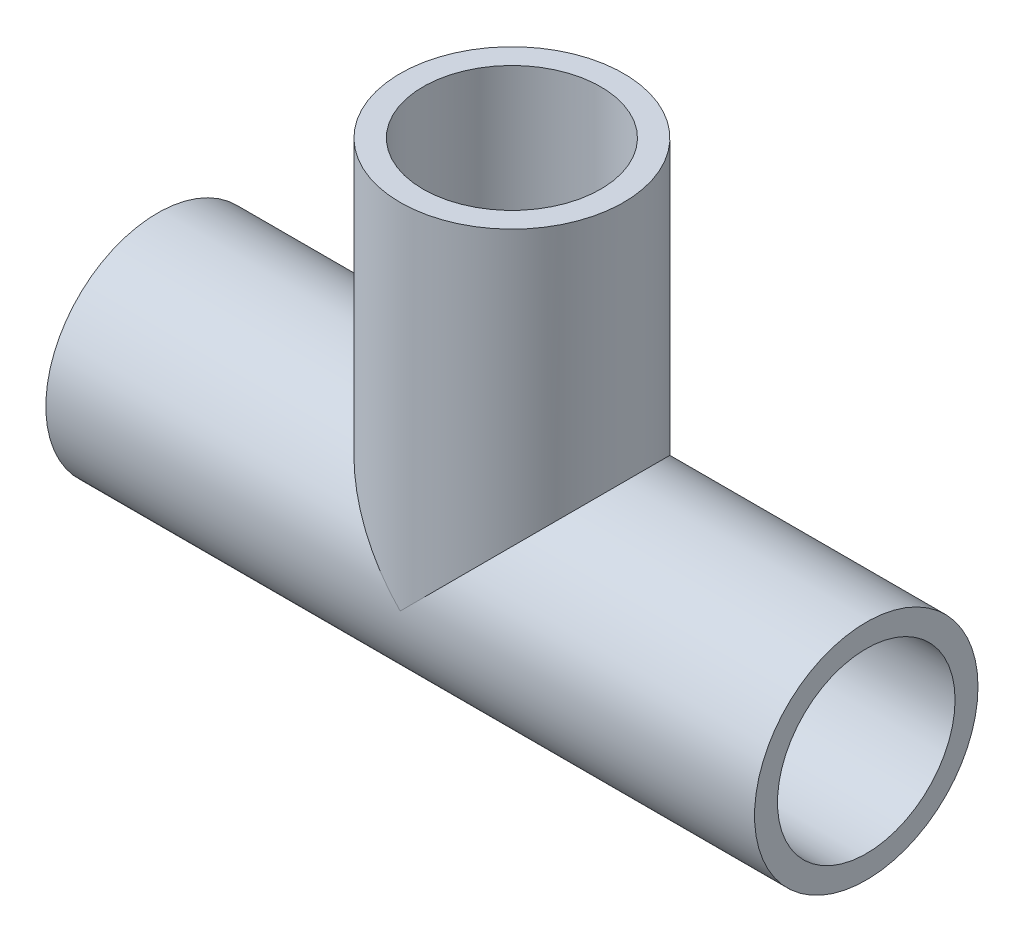
ISO-10303-21;
HEADER;
FILE_DESCRIPTION(('STEP AP214'),'2;1');
FILE_NAME('part.step','',(''),(''),'','','');
FILE_SCHEMA(('AUTOMOTIVE_DESIGN { 1 0 10303 214 1 1 1 1 }'));
ENDSEC;
DATA;
#1=APPLICATION_CONTEXT('core data for automotive mechanical design processes');
#2=APPLICATION_PROTOCOL_DEFINITION('international standard','automotive_design',2000,#1);
#3=PRODUCT_CONTEXT('',#1,'mechanical');
#4=PRODUCT('Part','Part','',(#3));
#5=PRODUCT_RELATED_PRODUCT_CATEGORY('part','',(#4));
#6=PRODUCT_DEFINITION_FORMATION('','',#4);
#7=PRODUCT_DEFINITION_CONTEXT('part definition',#1,'design');
#8=PRODUCT_DEFINITION('design','',#6,#7);
#9=PRODUCT_DEFINITION_SHAPE('','',#8);
#10=(LENGTH_UNIT() NAMED_UNIT(*) SI_UNIT(.MILLI.,.METRE.));
#11=(NAMED_UNIT(*) PLANE_ANGLE_UNIT() SI_UNIT($,.RADIAN.));
#12=(NAMED_UNIT(*) SI_UNIT($,.STERADIAN.) SOLID_ANGLE_UNIT());
#13=UNCERTAINTY_MEASURE_WITH_UNIT(LENGTH_MEASURE(1.E-05),#10,'distance_accuracy_value','');
#14=(GEOMETRIC_REPRESENTATION_CONTEXT(3) GLOBAL_UNCERTAINTY_ASSIGNED_CONTEXT((#13)) GLOBAL_UNIT_ASSIGNED_CONTEXT((#10,
#11,#12)) REPRESENTATION_CONTEXT('',''));
#15=CARTESIAN_POINT('',(0.,0.,0.));
#16=DIRECTION('',(0.,0.,1.));
#17=DIRECTION('',(1.,0.,0.));
#18=AXIS2_PLACEMENT_3D('',#15,#16,#17);
#19=CARTESIAN_POINT('',(84.9999999999998,0.,0.));
#20=DIRECTION('',(-0.999999999999997,0.,0.));
#21=DIRECTION('',(0.,0.,0.999999999999997));
#22=AXIS2_PLACEMENT_3D('',#19,#20,#21);
#23=CYLINDRICAL_SURFACE('',#22,13.4);
#24=CARTESIAN_POINT('',(0.,0.,0.));
#25=DIRECTION('',(0.999999999999997,0.,0.));
#26=DIRECTION('',(0.,0.,-0.999999999999997));
#27=AXIS2_PLACEMENT_3D('',#24,#25,#26);
#28=CIRCLE('',#27,13.4);
#29=CARTESIAN_POINT('',(0.,0.,-13.4));
#30=VERTEX_POINT('',#29);
#31=EDGE_CURVE('E129',#30,#30,#28,.T.);
#32=ORIENTED_EDGE('',*,*,#31,.T.);
#33=EDGE_LOOP('',(#32));
#34=FACE_BOUND('',#33,.T.);
#35=CARTESIAN_POINT('',(84.9999999999998,0.,0.));
#36=DIRECTION('',(0.999999999999997,0.,0.));
#37=DIRECTION('',(0.,0.,-0.999999999999997));
#38=AXIS2_PLACEMENT_3D('',#35,#36,#37);
#39=CIRCLE('',#38,13.4);
#40=CARTESIAN_POINT('',(84.9999999999998,0.,-13.4));
#41=VERTEX_POINT('',#40);
#42=EDGE_CURVE('E127',#41,#41,#39,.T.);
#43=ORIENTED_EDGE('',*,*,#42,.F.);
#44=EDGE_LOOP('',(#43));
#45=FACE_BOUND('',#44,.T.);
#46=CARTESIAN_POINT('',(42.5,0.,7.7715611723761E-13));
#47=DIRECTION('',(-0.707106781186544,-0.707106781186547,0.));
#48=DIRECTION('',(-0.707106781186544,0.707106781186547,0.));
#49=AXIS2_PLACEMENT_3D('',#46,#47,#48);
#50=ELLIPSE('',#49,18.9504617357995,13.4);
#51=CARTESIAN_POINT('',(42.4999999999998,0.,-13.3999999999992));
#52=VERTEX_POINT('',#51);
#53=CARTESIAN_POINT('',(42.5,0.,13.4000000000007));
#54=VERTEX_POINT('',#53);
#55=EDGE_CURVE('E139',#52,#54,#50,.F.);
#56=ORIENTED_EDGE('',*,*,#55,.F.);
#57=CARTESIAN_POINT('',(42.5,0.,7.7715611723761E-13));
#58=DIRECTION('',(-0.707106781186544,0.707106781186547,0.));
#59=DIRECTION('',(-0.707106781186544,-0.707106781186547,0.));
#60=AXIS2_PLACEMENT_3D('',#57,#58,#59);
#61=ELLIPSE('',#60,18.9504617357995,13.4);
#62=EDGE_CURVE('E144',#54,#52,#61,.T.);
#63=ORIENTED_EDGE('',*,*,#62,.F.);
#64=EDGE_LOOP('',(#56,#63));
#65=FACE_BOUND('',#64,.T.);
#66=ADVANCED_FACE('F34',(#34,#45,#65),#23,.T.);
#67=CARTESIAN_POINT('',(84.9999999999998,0.,0.));
#68=DIRECTION('',(0.999999999999997,0.,0.));
#69=DIRECTION('',(0.,0.,-0.999999999999997));
#70=AXIS2_PLACEMENT_3D('',#67,#68,#69);
#71=PLANE('',#70);
#72=ORIENTED_EDGE('',*,*,#42,.T.);
#73=EDGE_LOOP('',(#72));
#74=FACE_BOUND('',#73,.T.);
#75=CARTESIAN_POINT('',(84.9999999999998,0.,0.));
#76=DIRECTION('',(0.999999999999997,0.,0.));
#77=DIRECTION('',(0.,0.,-0.999999999999997));
#78=AXIS2_PLACEMENT_3D('',#75,#76,#77);
#79=CIRCLE('',#78,10.65);
#80=CARTESIAN_POINT('',(84.9999999999998,0.,-10.65));
#81=VERTEX_POINT('',#80);
#82=EDGE_CURVE('E134',#81,#81,#79,.T.);
#83=ORIENTED_EDGE('',*,*,#82,.F.);
#84=EDGE_LOOP('',(#83));
#85=FACE_BOUND('',#84,.T.);
#86=ADVANCED_FACE('F112',(#74,#85),#71,.T.);
#87=CARTESIAN_POINT('',(0.,0.,0.));
#88=DIRECTION('',(0.999999999999997,0.,0.));
#89=DIRECTION('',(0.,0.,-0.999999999999997));
#90=AXIS2_PLACEMENT_3D('',#87,#88,#89);
#91=PLANE('',#90);
#92=ORIENTED_EDGE('',*,*,#31,.F.);
#93=EDGE_LOOP('',(#92));
#94=FACE_BOUND('',#93,.T.);
#95=CARTESIAN_POINT('',(0.,0.,0.));
#96=DIRECTION('',(0.999999999999997,0.,0.));
#97=DIRECTION('',(0.,0.,-0.999999999999997));
#98=AXIS2_PLACEMENT_3D('',#95,#96,#97);
#99=CIRCLE('',#98,10.65);
#100=CARTESIAN_POINT('',(0.,0.,-10.65));
#101=VERTEX_POINT('',#100);
#102=EDGE_CURVE('E136',#101,#101,#99,.T.);
#103=ORIENTED_EDGE('',*,*,#102,.T.);
#104=EDGE_LOOP('',(#103));
#105=FACE_BOUND('',#104,.T.);
#106=ADVANCED_FACE('F181',(#94,#105),#91,.F.);
#107=CARTESIAN_POINT('',(42.4999999999999,42.44,7.7715611723761E-13));
#108=DIRECTION('',(0.,-1.,0.));
#109=DIRECTION('',(0.,0.,-0.999999999999997));
#110=AXIS2_PLACEMENT_3D('',#107,#108,#109);
#111=CYLINDRICAL_SURFACE('',#110,13.4);
#112=CARTESIAN_POINT('',(42.4999999999999,42.44,7.7715611723761E-13));
#113=DIRECTION('',(0.,1.,0.));
#114=DIRECTION('',(0.,0.,0.999999999999997));
#115=AXIS2_PLACEMENT_3D('',#112,#113,#114);
#116=CIRCLE('',#115,13.4);
#117=CARTESIAN_POINT('',(42.4999999999999,42.44,13.4000000000007));
#118=VERTEX_POINT('',#117);
#119=EDGE_CURVE('E147',#118,#118,#116,.T.);
#120=ORIENTED_EDGE('',*,*,#119,.F.);
#121=EDGE_LOOP('',(#120));
#122=FACE_BOUND('',#121,.T.);
#123=ORIENTED_EDGE('',*,*,#62,.T.);
#124=ORIENTED_EDGE('',*,*,#55,.T.);
#125=EDGE_LOOP('',(#123,#124));
#126=FACE_BOUND('',#125,.T.);
#127=ADVANCED_FACE('F110',(#122,#126),#111,.T.);
#128=CARTESIAN_POINT('',(42.4999999999999,42.44,7.7715611723761E-13));
#129=DIRECTION('',(0.,-1.,0.));
#130=DIRECTION('',(0.,0.,-0.999999999999997));
#131=AXIS2_PLACEMENT_3D('',#128,#129,#130);
#132=CYLINDRICAL_SURFACE('',#131,10.65);
#133=CARTESIAN_POINT('',(42.4999999999999,42.44,7.7715611723761E-13));
#134=DIRECTION('',(0.,1.,0.));
#135=DIRECTION('',(0.,0.,0.999999999999997));
#136=AXIS2_PLACEMENT_3D('',#133,#134,#135);
#137=CIRCLE('',#136,10.65);
#138=CARTESIAN_POINT('',(42.4999999999999,42.44,10.6500000000007));
#139=VERTEX_POINT('',#138);
#140=EDGE_CURVE('E150',#139,#139,#137,.T.);
#141=ORIENTED_EDGE('',*,*,#140,.T.);
#142=EDGE_LOOP('',(#141));
#143=FACE_BOUND('',#142,.T.);
#144=CARTESIAN_POINT('',(42.5,0.,7.7715611723761E-13));
#145=DIRECTION('',(-0.707106781186544,0.707106781186547,0.));
#146=DIRECTION('',(-0.707106781186544,-0.707106781186547,0.));
#147=AXIS2_PLACEMENT_3D('',#144,#145,#146);
#148=ELLIPSE('',#147,15.0613744392735,10.65);
#149=CARTESIAN_POINT('',(42.4999999999998,0.,-10.6499999999993));
#150=VERTEX_POINT('',#149);
#151=CARTESIAN_POINT('',(42.5,0.,10.6500000000008));
#152=VERTEX_POINT('',#151);
#153=EDGE_CURVE('E78',#150,#152,#148,.F.);
#154=ORIENTED_EDGE('',*,*,#153,.T.);
#155=CARTESIAN_POINT('',(42.5,0.,7.7715611723761E-13));
#156=DIRECTION('',(-0.707106781186544,-0.707106781186547,0.));
#157=DIRECTION('',(-0.707106781186544,0.707106781186547,0.));
#158=AXIS2_PLACEMENT_3D('',#155,#156,#157);
#159=ELLIPSE('',#158,15.0613744392735,10.65);
#160=EDGE_CURVE('E89',#152,#150,#159,.T.);
#161=ORIENTED_EDGE('',*,*,#160,.T.);
#162=EDGE_LOOP('',(#154,#161));
#163=FACE_BOUND('',#162,.T.);
#164=ADVANCED_FACE('F163',(#143,#163),#132,.F.);
#165=CARTESIAN_POINT('',(42.4999999999999,42.44,7.7715611723761E-13));
#166=DIRECTION('',(0.,1.,0.));
#167=DIRECTION('',(0.,0.,0.999999999999997));
#168=AXIS2_PLACEMENT_3D('',#165,#166,#167);
#169=PLANE('',#168);
#170=ORIENTED_EDGE('',*,*,#119,.T.);
#171=EDGE_LOOP('',(#170));
#172=FACE_BOUND('',#171,.T.);
#173=ORIENTED_EDGE('',*,*,#140,.F.);
#174=EDGE_LOOP('',(#173));
#175=FACE_BOUND('',#174,.T.);
#176=ADVANCED_FACE('F109',(#172,#175),#169,.T.);
#177=CARTESIAN_POINT('',(84.9999999999998,0.,0.));
#178=DIRECTION('',(-0.999999999999997,0.,0.));
#179=DIRECTION('',(0.,0.,0.999999999999997));
#180=AXIS2_PLACEMENT_3D('',#177,#178,#179);
#181=CYLINDRICAL_SURFACE('',#180,10.65);
#182=CARTESIAN_POINT('',(42.5,0.,7.7715611723761E-13));
#183=DIRECTION('',(-0.707106781186544,-0.707106781186547,0.));
#184=DIRECTION('',(-0.707106781186544,0.707106781186547,0.));
#185=AXIS2_PLACEMENT_3D('',#182,#183,#184);
#186=ELLIPSE('',#185,15.0613744392735,10.65);
#187=CARTESIAN_POINT('',(42.55743836696,-0.0574383669606068,-10.6498451084504));
#188=VERTEX_POINT('',#187);
#189=EDGE_CURVE('E11',#188,#150,#186,.F.);
#190=ORIENTED_EDGE('',*,*,#189,.F.);
#191=CARTESIAN_POINT('',(42.5574383669601,-0.0574383669605979,-10.6498451084511));
#192=DIRECTION('',(-1.,0.,0.));
#193=VECTOR('',#192,1.);
#194=LINE('',#191,#193);
#195=CARTESIAN_POINT('',(42.4425616330395,-0.0574383669606007,-10.6498451084504));
#196=VERTEX_POINT('',#195);
#197=EDGE_CURVE('E43',#188,#196,#194,.T.);
#198=ORIENTED_EDGE('',*,*,#197,.T.);
#199=CARTESIAN_POINT('',(42.5,0.,7.7715611723761E-13));
#200=DIRECTION('',(-0.707106781186544,0.707106781186547,0.));
#201=DIRECTION('',(-0.707106781186544,-0.707106781186547,0.));
#202=AXIS2_PLACEMENT_3D('',#199,#200,#201);
#203=ELLIPSE('',#202,15.0613744392735,10.65);
#204=EDGE_CURVE('E37',#150,#196,#203,.T.);
#205=ORIENTED_EDGE('',*,*,#204,.F.);
#206=ORIENTED_EDGE('',*,*,#160,.F.);
#207=CARTESIAN_POINT('',(42.4425616330397,-0.0574383669606007,10.6498451084519));
#208=VERTEX_POINT('',#207);
#209=EDGE_CURVE('E86',#208,#152,#203,.T.);
#210=ORIENTED_EDGE('',*,*,#209,.F.);
#211=CARTESIAN_POINT('',(42.4425616330397,-0.0574383669606018,10.6498451084511));
#212=DIRECTION('',(1.,0.,0.));
#213=VECTOR('',#212,1.);
#214=LINE('',#211,#213);
#215=CARTESIAN_POINT('',(42.5574383669601,-0.0574383669606007,10.6498451084519));
#216=VERTEX_POINT('',#215);
#217=EDGE_CURVE('E93',#208,#216,#214,.T.);
#218=ORIENTED_EDGE('',*,*,#217,.T.);
#219=EDGE_CURVE('E56',#152,#216,#186,.F.);
#220=ORIENTED_EDGE('',*,*,#219,.F.);
#221=ORIENTED_EDGE('',*,*,#153,.F.);
#222=EDGE_LOOP('',(#190,#198,#205,#206,#210,#218,#220,#221));
#223=FACE_BOUND('',#222,.T.);
#224=ORIENTED_EDGE('',*,*,#102,.F.);
#225=EDGE_LOOP('',(#224));
#226=FACE_BOUND('',#225,.T.);
#227=ORIENTED_EDGE('',*,*,#82,.T.);
#228=EDGE_LOOP('',(#227));
#229=FACE_BOUND('',#228,.T.);
#230=ADVANCED_FACE('F82',(#223,#226,#229),#181,.F.);
#231=CARTESIAN_POINT('',(42.5,-0.0574383669606007,7.7715611723761E-13));
#232=DIRECTION('',(0.,1.,0.));
#233=DIRECTION('',(0.,0.,0.999999999999997));
#234=AXIS2_PLACEMENT_3D('',#231,#232,#233);
#235=CYLINDRICAL_SURFACE('',#234,10.65);
#236=ORIENTED_EDGE('',*,*,#219,.T.);
#237=ORIENTED_EDGE('',*,*,#217,.F.);
#238=ORIENTED_EDGE('',*,*,#209,.T.);
#239=EDGE_LOOP('',(#236,#237,#238));
#240=FACE_BOUND('',#239,.T.);
#241=ADVANCED_FACE('F108',(#240),#235,.F.);
#242=ORIENTED_EDGE('',*,*,#204,.T.);
#243=ORIENTED_EDGE('',*,*,#197,.F.);
#244=ORIENTED_EDGE('',*,*,#189,.T.);
#245=EDGE_LOOP('',(#242,#243,#244));
#246=FACE_BOUND('',#245,.T.);
#247=ADVANCED_FACE('F74',(#246),#235,.F.);
#248=CLOSED_SHELL('',(#66,#86,#106,#127,#164,#176,#230,#241,#247));
#249=MANIFOLD_SOLID_BREP('B2',#248);
#250=ADVANCED_BREP_SHAPE_REPRESENTATION('',(#18,#249),#14);
#251=SHAPE_DEFINITION_REPRESENTATION(#9,#250);
ENDSEC;
END-ISO-10303-21;
